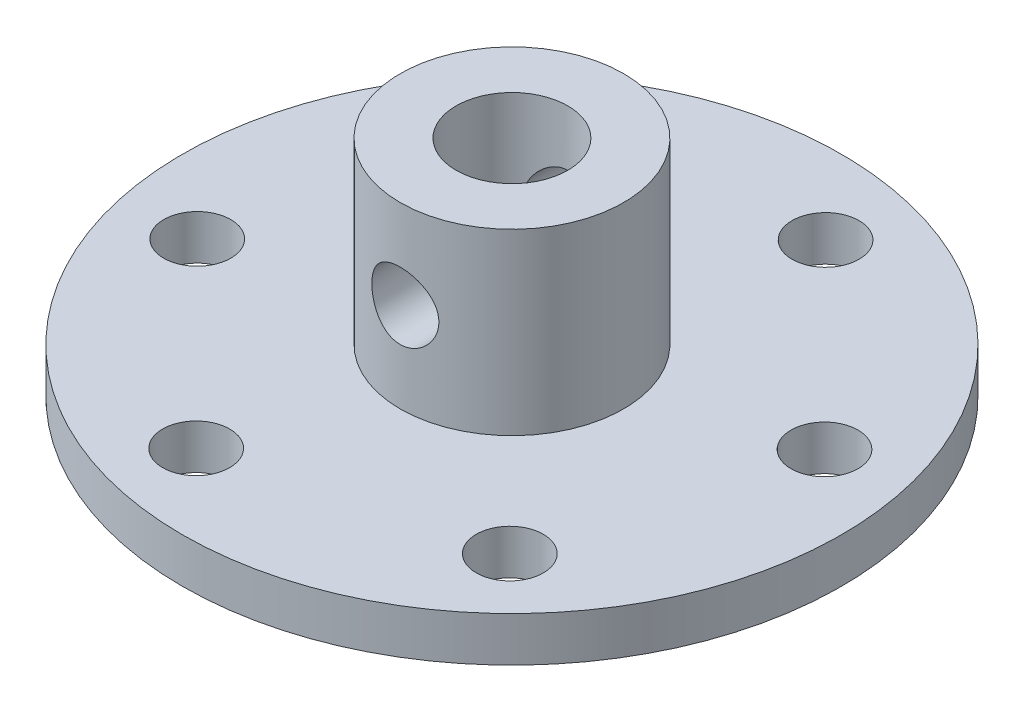
ISO-10303-21;
HEADER;
FILE_DESCRIPTION(('STEP AP214'),'2;1');
FILE_NAME('part.step','',(''),(''),'','','');
FILE_SCHEMA(('AUTOMOTIVE_DESIGN { 1 0 10303 214 1 1 1 1 }'));
ENDSEC;
DATA;
#1=APPLICATION_CONTEXT('core data for automotive mechanical design processes');
#2=APPLICATION_PROTOCOL_DEFINITION('international standard','automotive_design',2000,#1);
#3=PRODUCT_CONTEXT('',#1,'mechanical');
#4=PRODUCT('Part','Part','',(#3));
#5=PRODUCT_RELATED_PRODUCT_CATEGORY('part','',(#4));
#6=PRODUCT_DEFINITION_FORMATION('','',#4);
#7=PRODUCT_DEFINITION_CONTEXT('part definition',#1,'design');
#8=PRODUCT_DEFINITION('design','',#6,#7);
#9=PRODUCT_DEFINITION_SHAPE('','',#8);
#10=(LENGTH_UNIT() NAMED_UNIT(*) SI_UNIT(.MILLI.,.METRE.));
#11=(NAMED_UNIT(*) PLANE_ANGLE_UNIT() SI_UNIT($,.RADIAN.));
#12=(NAMED_UNIT(*) SI_UNIT($,.STERADIAN.) SOLID_ANGLE_UNIT());
#13=UNCERTAINTY_MEASURE_WITH_UNIT(LENGTH_MEASURE(1.E-05),#10,'distance_accuracy_value','');
#14=(GEOMETRIC_REPRESENTATION_CONTEXT(3) GLOBAL_UNCERTAINTY_ASSIGNED_CONTEXT((#13)) GLOBAL_UNIT_ASSIGNED_CONTEXT((#10,
#11,#12)) REPRESENTATION_CONTEXT('',''));
#15=CARTESIAN_POINT('',(0.,0.,0.));
#16=DIRECTION('',(0.,0.,1.));
#17=DIRECTION('',(1.,0.,0.));
#18=AXIS2_PLACEMENT_3D('',#15,#16,#17);
#19=CARTESIAN_POINT('',(0.,4.,0.));
#20=DIRECTION('',(0.,1.,0.));
#21=DIRECTION('',(0.,0.,1.));
#22=AXIS2_PLACEMENT_3D('',#19,#20,#21);
#23=PLANE('',#22);
#24=CARTESIAN_POINT('',(0.,4.,0.));
#25=DIRECTION('',(0.,1.,0.));
#26=DIRECTION('',(0.,0.,1.));
#27=AXIS2_PLACEMENT_3D('',#24,#25,#26);
#28=CIRCLE('',#27,10.);
#29=CARTESIAN_POINT('',(0.,4.,10.));
#30=VERTEX_POINT('',#29);
#31=EDGE_CURVE('E178',#30,#30,#28,.T.);
#32=ORIENTED_EDGE('',*,*,#31,.F.);
#33=EDGE_LOOP('',(#32));
#34=FACE_BOUND('',#33,.T.);
#35=CARTESIAN_POINT('',(-6.08221572617099,4.,22.1816273574126));
#36=DIRECTION('',(0.,1.,0.));
#37=DIRECTION('',(0.,0.,1.));
#38=AXIS2_PLACEMENT_3D('',#35,#36,#37);
#39=CIRCLE('',#38,3.);
#40=CARTESIAN_POINT('',(-6.08221572617099,4.,25.1816273574126));
#41=VERTEX_POINT('',#40);
#42=EDGE_CURVE('E182',#41,#41,#39,.T.);
#43=ORIENTED_EDGE('',*,*,#42,.F.);
#44=EDGE_LOOP('',(#43));
#45=FACE_BOUND('',#44,.T.);
#46=CARTESIAN_POINT('',(22.1215829630717,4.,-5.85812699578095));
#47=DIRECTION('',(0.,1.,0.));
#48=DIRECTION('',(0.,0.,1.));
#49=AXIS2_PLACEMENT_3D('',#46,#47,#48);
#50=CIRCLE('',#49,3.);
#51=CARTESIAN_POINT('',(22.1215829630717,4.,-2.85812699578095));
#52=VERTEX_POINT('',#51);
#53=EDGE_CURVE('E193',#52,#52,#50,.T.);
#54=ORIENTED_EDGE('',*,*,#53,.F.);
#55=EDGE_LOOP('',(#54));
#56=FACE_BOUND('',#55,.T.);
#57=CARTESIAN_POINT('',(-16.2634559672906,4.,-16.2634559672906));
#58=DIRECTION('',(0.,1.,0.));
#59=DIRECTION('',(0.,0.,1.));
#60=AXIS2_PLACEMENT_3D('',#57,#58,#59);
#61=CIRCLE('',#60,3.);
#62=CARTESIAN_POINT('',(-16.2634559672906,4.,-13.2634559672906));
#63=VERTEX_POINT('',#62);
#64=EDGE_CURVE('E204',#63,#63,#61,.T.);
#65=ORIENTED_EDGE('',*,*,#64,.F.);
#66=EDGE_LOOP('',(#65));
#67=FACE_BOUND('',#66,.T.);
#68=CARTESIAN_POINT('',(0.,4.,0.));
#69=DIRECTION('',(0.,1.,0.));
#70=DIRECTION('',(0.,0.,1.));
#71=AXIS2_PLACEMENT_3D('',#68,#69,#70);
#72=CIRCLE('',#71,29.5);
#73=CARTESIAN_POINT('',(0.,4.,29.5));
#74=VERTEX_POINT('',#73);
#75=EDGE_CURVE('E55',#74,#74,#72,.T.);
#76=ORIENTED_EDGE('',*,*,#75,.T.);
#77=EDGE_LOOP('',(#76));
#78=FACE_BOUND('',#77,.T.);
#79=CARTESIAN_POINT('',(5.93282323924444,4.,-22.1415977611853));
#80=DIRECTION('',(0.,1.,0.));
#81=DIRECTION('',(0.,0.,1.));
#82=AXIS2_PLACEMENT_3D('',#79,#80,#81);
#83=CIRCLE('',#82,3.);
#84=CARTESIAN_POINT('',(5.93282323924444,4.,-19.1415977611853));
#85=VERTEX_POINT('',#84);
#86=EDGE_CURVE('E198',#85,#85,#83,.T.);
#87=ORIENTED_EDGE('',*,*,#86,.F.);
#88=EDGE_LOOP('',(#87));
#89=FACE_BOUND('',#88,.T.);
#90=CARTESIAN_POINT('',(16.114063480364,4.,16.303485563518));
#91=DIRECTION('',(0.,1.,0.));
#92=DIRECTION('',(0.,0.,1.));
#93=AXIS2_PLACEMENT_3D('',#90,#91,#92);
#94=CIRCLE('',#93,3.);
#95=CARTESIAN_POINT('',(16.114063480364,4.,19.303485563518));
#96=VERTEX_POINT('',#95);
#97=EDGE_CURVE('E187',#96,#96,#94,.T.);
#98=ORIENTED_EDGE('',*,*,#97,.F.);
#99=EDGE_LOOP('',(#98));
#100=FACE_BOUND('',#99,.T.);
#101=CARTESIAN_POINT('',(-22.2709754499983,4.,5.89815659200832));
#102=DIRECTION('',(0.,1.,0.));
#103=DIRECTION('',(0.,0.,1.));
#104=AXIS2_PLACEMENT_3D('',#101,#102,#103);
#105=CIRCLE('',#104,3.);
#106=CARTESIAN_POINT('',(-22.2709754499983,4.,8.89815659200832));
#107=VERTEX_POINT('',#106);
#108=EDGE_CURVE('E168',#107,#107,#105,.T.);
#109=ORIENTED_EDGE('',*,*,#108,.F.);
#110=EDGE_LOOP('',(#109));
#111=FACE_BOUND('',#110,.T.);
#112=ADVANCED_FACE('F41',(#34,#45,#56,#67,#78,#89,#100,#111),#23,.T.);
#113=CARTESIAN_POINT('',(0.,0.,0.));
#114=DIRECTION('',(0.,1.,0.));
#115=DIRECTION('',(0.,0.,1.));
#116=AXIS2_PLACEMENT_3D('',#113,#114,#115);
#117=PLANE('',#116);
#118=CARTESIAN_POINT('',(0.,0.,0.));
#119=DIRECTION('',(0.,1.,0.));
#120=DIRECTION('',(0.,0.,1.));
#121=AXIS2_PLACEMENT_3D('',#118,#119,#120);
#122=CIRCLE('',#121,29.5);
#123=CARTESIAN_POINT('',(0.,0.,29.5));
#124=VERTEX_POINT('',#123);
#125=EDGE_CURVE('E63',#124,#124,#122,.T.);
#126=ORIENTED_EDGE('',*,*,#125,.F.);
#127=EDGE_LOOP('',(#126));
#128=FACE_BOUND('',#127,.T.);
#129=CARTESIAN_POINT('',(-16.2634559672906,0.,-16.2634559672906));
#130=DIRECTION('',(0.,1.,0.));
#131=DIRECTION('',(0.,0.,1.));
#132=AXIS2_PLACEMENT_3D('',#129,#130,#131);
#133=CIRCLE('',#132,3.);
#134=CARTESIAN_POINT('',(-16.2634559672906,0.,-13.2634559672906));
#135=VERTEX_POINT('',#134);
#136=EDGE_CURVE('E146',#135,#135,#133,.T.);
#137=ORIENTED_EDGE('',*,*,#136,.T.);
#138=EDGE_LOOP('',(#137));
#139=FACE_BOUND('',#138,.T.);
#140=CARTESIAN_POINT('',(5.93282323924444,0.,-22.1415977611853));
#141=DIRECTION('',(0.,1.,0.));
#142=DIRECTION('',(0.,0.,1.));
#143=AXIS2_PLACEMENT_3D('',#140,#141,#142);
#144=CIRCLE('',#143,3.);
#145=CARTESIAN_POINT('',(5.93282323924444,0.,-19.1415977611853));
#146=VERTEX_POINT('',#145);
#147=EDGE_CURVE('E150',#146,#146,#144,.T.);
#148=ORIENTED_EDGE('',*,*,#147,.T.);
#149=EDGE_LOOP('',(#148));
#150=FACE_BOUND('',#149,.T.);
#151=CARTESIAN_POINT('',(22.1215829630717,0.,-5.85812699578095));
#152=DIRECTION('',(0.,1.,0.));
#153=DIRECTION('',(0.,0.,1.));
#154=AXIS2_PLACEMENT_3D('',#151,#152,#153);
#155=CIRCLE('',#154,3.);
#156=CARTESIAN_POINT('',(22.1215829630717,0.,-2.85812699578095));
#157=VERTEX_POINT('',#156);
#158=EDGE_CURVE('E154',#157,#157,#155,.T.);
#159=ORIENTED_EDGE('',*,*,#158,.T.);
#160=EDGE_LOOP('',(#159));
#161=FACE_BOUND('',#160,.T.);
#162=CARTESIAN_POINT('',(16.114063480364,0.,16.303485563518));
#163=DIRECTION('',(0.,1.,0.));
#164=DIRECTION('',(0.,0.,1.));
#165=AXIS2_PLACEMENT_3D('',#162,#163,#164);
#166=CIRCLE('',#165,3.);
#167=CARTESIAN_POINT('',(16.114063480364,0.,19.303485563518));
#168=VERTEX_POINT('',#167);
#169=EDGE_CURVE('E158',#168,#168,#166,.T.);
#170=ORIENTED_EDGE('',*,*,#169,.T.);
#171=EDGE_LOOP('',(#170));
#172=FACE_BOUND('',#171,.T.);
#173=CARTESIAN_POINT('',(-6.08221572617099,0.,22.1816273574126));
#174=DIRECTION('',(0.,1.,0.));
#175=DIRECTION('',(0.,0.,1.));
#176=AXIS2_PLACEMENT_3D('',#173,#174,#175);
#177=CIRCLE('',#176,3.);
#178=CARTESIAN_POINT('',(-6.08221572617099,0.,25.1816273574126));
#179=VERTEX_POINT('',#178);
#180=EDGE_CURVE('E162',#179,#179,#177,.T.);
#181=ORIENTED_EDGE('',*,*,#180,.T.);
#182=EDGE_LOOP('',(#181));
#183=FACE_BOUND('',#182,.T.);
#184=CARTESIAN_POINT('',(-22.2709754499983,0.,5.89815659200832));
#185=DIRECTION('',(0.,1.,0.));
#186=DIRECTION('',(0.,0.,1.));
#187=AXIS2_PLACEMENT_3D('',#184,#185,#186);
#188=CIRCLE('',#187,3.);
#189=CARTESIAN_POINT('',(-22.2709754499983,0.,8.89815659200832));
#190=VERTEX_POINT('',#189);
#191=EDGE_CURVE('E165',#190,#190,#188,.T.);
#192=ORIENTED_EDGE('',*,*,#191,.T.);
#193=EDGE_LOOP('',(#192));
#194=FACE_BOUND('',#193,.T.);
#195=ADVANCED_FACE('F129',(#128,#139,#150,#161,#172,#183,#194),#117,.F.);
#196=CARTESIAN_POINT('',(0.,4.,0.));
#197=DIRECTION('',(0.,-1.,0.));
#198=DIRECTION('',(0.,0.,-1.));
#199=AXIS2_PLACEMENT_3D('',#196,#197,#198);
#200=CYLINDRICAL_SURFACE('',#199,29.5);
#201=ORIENTED_EDGE('',*,*,#75,.F.);
#202=EDGE_LOOP('',(#201));
#203=FACE_BOUND('',#202,.T.);
#204=ORIENTED_EDGE('',*,*,#125,.T.);
#205=EDGE_LOOP('',(#204));
#206=FACE_BOUND('',#205,.T.);
#207=ADVANCED_FACE('F43',(#203,#206),#200,.T.);
#208=CARTESIAN_POINT('',(-16.2634559672906,4.,-16.2634559672906));
#209=DIRECTION('',(0.,-1.,0.));
#210=DIRECTION('',(0.,0.,-1.));
#211=AXIS2_PLACEMENT_3D('',#208,#209,#210);
#212=CYLINDRICAL_SURFACE('',#211,3.);
#213=ORIENTED_EDGE('',*,*,#64,.T.);
#214=EDGE_LOOP('',(#213));
#215=FACE_BOUND('',#214,.T.);
#216=ORIENTED_EDGE('',*,*,#136,.F.);
#217=EDGE_LOOP('',(#216));
#218=FACE_BOUND('',#217,.T.);
#219=ADVANCED_FACE('F123',(#215,#218),#212,.F.);
#220=CARTESIAN_POINT('',(5.93282323924444,4.,-22.1415977611853));
#221=DIRECTION('',(0.,-1.,0.));
#222=DIRECTION('',(0.,0.,-1.));
#223=AXIS2_PLACEMENT_3D('',#220,#221,#222);
#224=CYLINDRICAL_SURFACE('',#223,3.);
#225=ORIENTED_EDGE('',*,*,#86,.T.);
#226=EDGE_LOOP('',(#225));
#227=FACE_BOUND('',#226,.T.);
#228=ORIENTED_EDGE('',*,*,#147,.F.);
#229=EDGE_LOOP('',(#228));
#230=FACE_BOUND('',#229,.T.);
#231=ADVANCED_FACE('F119',(#227,#230),#224,.F.);
#232=CARTESIAN_POINT('',(22.1215829630717,4.,-5.85812699578095));
#233=DIRECTION('',(0.,-1.,0.));
#234=DIRECTION('',(0.,0.,-1.));
#235=AXIS2_PLACEMENT_3D('',#232,#233,#234);
#236=CYLINDRICAL_SURFACE('',#235,3.);
#237=ORIENTED_EDGE('',*,*,#53,.T.);
#238=EDGE_LOOP('',(#237));
#239=FACE_BOUND('',#238,.T.);
#240=ORIENTED_EDGE('',*,*,#158,.F.);
#241=EDGE_LOOP('',(#240));
#242=FACE_BOUND('',#241,.T.);
#243=ADVANCED_FACE('F115',(#239,#242),#236,.F.);
#244=CARTESIAN_POINT('',(16.114063480364,4.,16.303485563518));
#245=DIRECTION('',(0.,-1.,0.));
#246=DIRECTION('',(0.,0.,-1.));
#247=AXIS2_PLACEMENT_3D('',#244,#245,#246);
#248=CYLINDRICAL_SURFACE('',#247,3.);
#249=ORIENTED_EDGE('',*,*,#97,.T.);
#250=EDGE_LOOP('',(#249));
#251=FACE_BOUND('',#250,.T.);
#252=ORIENTED_EDGE('',*,*,#169,.F.);
#253=EDGE_LOOP('',(#252));
#254=FACE_BOUND('',#253,.T.);
#255=ADVANCED_FACE('F111',(#251,#254),#248,.F.);
#256=CARTESIAN_POINT('',(-6.08221572617099,4.,22.1816273574126));
#257=DIRECTION('',(0.,-1.,0.));
#258=DIRECTION('',(0.,0.,-1.));
#259=AXIS2_PLACEMENT_3D('',#256,#257,#258);
#260=CYLINDRICAL_SURFACE('',#259,3.);
#261=ORIENTED_EDGE('',*,*,#42,.T.);
#262=EDGE_LOOP('',(#261));
#263=FACE_BOUND('',#262,.T.);
#264=ORIENTED_EDGE('',*,*,#180,.F.);
#265=EDGE_LOOP('',(#264));
#266=FACE_BOUND('',#265,.T.);
#267=ADVANCED_FACE('F107',(#263,#266),#260,.F.);
#268=CARTESIAN_POINT('',(-22.2709754499983,4.,5.89815659200832));
#269=DIRECTION('',(0.,-1.,0.));
#270=DIRECTION('',(0.,0.,-1.));
#271=AXIS2_PLACEMENT_3D('',#268,#269,#270);
#272=CYLINDRICAL_SURFACE('',#271,3.);
#273=ORIENTED_EDGE('',*,*,#108,.T.);
#274=EDGE_LOOP('',(#273));
#275=FACE_BOUND('',#274,.T.);
#276=ORIENTED_EDGE('',*,*,#191,.F.);
#277=EDGE_LOOP('',(#276));
#278=FACE_BOUND('',#277,.T.);
#279=ADVANCED_FACE('F103',(#275,#278),#272,.F.);
#280=CARTESIAN_POINT('',(0.,20.,0.));
#281=DIRECTION('',(0.,1.,0.));
#282=DIRECTION('',(0.,0.,1.));
#283=AXIS2_PLACEMENT_3D('',#280,#281,#282);
#284=PLANE('',#283);
#285=CARTESIAN_POINT('',(0.,20.,0.));
#286=DIRECTION('',(0.,1.,0.));
#287=DIRECTION('',(0.,0.,1.));
#288=AXIS2_PLACEMENT_3D('',#285,#286,#287);
#289=CIRCLE('',#288,10.);
#290=CARTESIAN_POINT('',(0.,20.,10.));
#291=VERTEX_POINT('',#290);
#292=EDGE_CURVE('E169',#291,#291,#289,.T.);
#293=ORIENTED_EDGE('',*,*,#292,.T.);
#294=EDGE_LOOP('',(#293));
#295=FACE_BOUND('',#294,.T.);
#296=CARTESIAN_POINT('',(0.,20.,0.));
#297=DIRECTION('',(0.,1.,0.));
#298=DIRECTION('',(0.,0.,1.));
#299=AXIS2_PLACEMENT_3D('',#296,#297,#298);
#300=CIRCLE('',#299,5.);
#301=CARTESIAN_POINT('',(0.,20.,5.));
#302=VERTEX_POINT('',#301);
#303=EDGE_CURVE('E215',#302,#302,#300,.T.);
#304=ORIENTED_EDGE('',*,*,#303,.F.);
#305=EDGE_LOOP('',(#304));
#306=FACE_BOUND('',#305,.T.);
#307=ADVANCED_FACE('F101',(#295,#306),#284,.T.);
#308=CARTESIAN_POINT('',(0.,20.,0.));
#309=DIRECTION('',(0.,-1.,0.));
#310=DIRECTION('',(0.,0.,-1.));
#311=AXIS2_PLACEMENT_3D('',#308,#309,#310);
#312=CYLINDRICAL_SURFACE('',#311,10.);
#313=CARTESIAN_POINT('',(0.,15.,-10.));
#314=CARTESIAN_POINT('',(-0.1645772255066,14.9999980050302,-9.99999858501101));
#315=CARTESIAN_POINT('',(-0.329174636703059,14.9864122727521,-9.99589831387907));
#316=CARTESIAN_POINT('',(-0.653576250609762,14.9325572915558,-9.97994211187382));
#317=CARTESIAN_POINT('',(-0.81337900882284,14.8922800839533,-9.96808386779384));
#318=CARTESIAN_POINT('',(-1.12346541550905,14.7865079661795,-9.93791105003673));
#319=CARTESIAN_POINT('',(-1.27376272879075,14.7210502607621,-9.91960600500851));
#320=CARTESIAN_POINT('',(-1.56124836210626,14.5669278138883,-9.87844218475291));
#321=CARTESIAN_POINT('',(-1.69843493493934,14.4782599852092,-9.85558280384133));
#322=CARTESIAN_POINT('',(-1.95974359436749,14.2775519850547,-9.80701474385548));
#323=CARTESIAN_POINT('',(-2.08343614248868,14.1649667482282,-9.78124767314073));
#324=CARTESIAN_POINT('',(-2.31049841846647,13.9207815401796,-9.73011668420884));
#325=CARTESIAN_POINT('',(-2.41386472654882,13.7891783757501,-9.70475283449003));
#326=CARTESIAN_POINT('',(-2.59960075447415,13.5070584939248,-9.65668227987544));
#327=CARTESIAN_POINT('',(-2.68144618044427,13.3561830780185,-9.63404813327749));
#328=CARTESIAN_POINT('',(-2.81842789549521,13.0420214915394,-9.59487240788062));
#329=CARTESIAN_POINT('',(-2.87357059839947,12.878738312144,-9.57832936626621));
#330=CARTESIAN_POINT('',(-2.95403267365303,12.5492194677391,-9.55381741676868));
#331=CARTESIAN_POINT('',(-2.98014392469355,12.3831945122721,-9.54562138649067));
#332=CARTESIAN_POINT('',(-3.00427461229344,12.0489336875665,-9.53805579499534));
#333=CARTESIAN_POINT('',(-3.00230085522157,11.8806983638818,-9.53868409521142));
#334=CARTESIAN_POINT('',(-2.97093954399623,11.553232182783,-9.54849488135555));
#335=CARTESIAN_POINT('',(-2.9425441052537,11.3938954992755,-9.55736777198281));
#336=CARTESIAN_POINT('',(-2.86074840854112,11.0823604274531,-9.58216712457248));
#337=CARTESIAN_POINT('',(-2.80734568283282,10.9301627452513,-9.59809428264701));
#338=CARTESIAN_POINT('',(-2.67632053307363,10.6347993006785,-9.63545466149946));
#339=CARTESIAN_POINT('',(-2.59837633869285,10.4917858320895,-9.65696032231904));
#340=CARTESIAN_POINT('',(-2.42070445177367,10.2205359559796,-9.70301974000129));
#341=CARTESIAN_POINT('',(-2.32097148005177,10.0923031411724,-9.72757423493982));
#342=CARTESIAN_POINT('',(-2.09762581531093,9.84862761847596,-9.77822022595875));
#343=CARTESIAN_POINT('',(-1.97318981493394,9.73394267194066,-9.80433308620996));
#344=CARTESIAN_POINT('',(-1.70652651862793,9.5268920318715,-9.85424488126517));
#345=CARTESIAN_POINT('',(-1.56429810372178,9.43452774317115,-9.8780436703682));
#346=CARTESIAN_POINT('',(-1.26471007668561,9.27428015507054,-9.92086320138941));
#347=CARTESIAN_POINT('',(-1.1072554994959,9.20656496750028,-9.93985087336628));
#348=CARTESIAN_POINT('',(-0.782490831207039,9.09880081980074,-9.97067043664444));
#349=CARTESIAN_POINT('',(-0.615183503179163,9.05874414293502,-9.98250432373999));
#350=CARTESIAN_POINT('',(-0.281904485336664,9.00869564420121,-9.99736729287077));
#351=CARTESIAN_POINT('',(-0.116100195202375,8.99767682839678,-10.0006970083558));
#352=CARTESIAN_POINT('',(0.214999211646765,9.00313831142416,-9.99905846483519));
#353=CARTESIAN_POINT('',(0.380294393381561,9.01961493930289,-9.99409131355514));
#354=CARTESIAN_POINT('',(0.701807210619393,9.07876922222299,-9.97661393974325));
#355=CARTESIAN_POINT('',(0.858145545228339,9.12084677516174,-9.96427659598829));
#356=CARTESIAN_POINT('',(1.16150927790904,9.2292864655564,-9.9334869568307));
#357=CARTESIAN_POINT('',(1.30853355405117,9.29565152207572,-9.91503392642188));
#358=CARTESIAN_POINT('',(1.5928743789221,9.45250633096227,-9.87339308702631));
#359=CARTESIAN_POINT('',(1.72988765239933,9.54351868189596,-9.8501056165928));
#360=CARTESIAN_POINT('',(1.9870466159603,9.74644950810561,-9.80146937528705));
#361=CARTESIAN_POINT('',(2.10718806471188,9.8583732237753,-9.7761200886242));
#362=CARTESIAN_POINT('',(2.33171489102052,10.1047746167387,-9.72506343738007));
#363=CARTESIAN_POINT('',(2.43536962463001,10.2399237515437,-9.69937650065513));
#364=CARTESIAN_POINT('',(2.61857990144313,10.5262558780269,-9.65153030477949));
#365=CARTESIAN_POINT('',(2.69813607658965,10.6774384491158,-9.62937095313121));
#366=CARTESIAN_POINT('',(2.83034694254316,10.99106498251,-9.5913437922631));
#367=CARTESIAN_POINT('',(2.88312693874022,11.1534523730757,-9.57544675673501));
#368=CARTESIAN_POINT('',(2.96043461630306,11.4853759378605,-9.55183188739737));
#369=CARTESIAN_POINT('',(2.98497197957849,11.6549096415661,-9.54411125069387));
#370=CARTESIAN_POINT('',(3.0044396896993,11.9887230367768,-9.53799944941558));
#371=CARTESIAN_POINT('',(3.00056110615887,12.1529273020988,-9.53923294700394));
#372=CARTESIAN_POINT('',(2.9661501088861,12.4782282068012,-9.54998802392188));
#373=CARTESIAN_POINT('',(2.93561876249408,12.639324970361,-9.55950927135902));
#374=CARTESIAN_POINT('',(2.84953777608686,12.9518907982633,-9.58551527389243));
#375=CARTESIAN_POINT('',(2.79430351014248,13.1034545747174,-9.60191209104934));
#376=CARTESIAN_POINT('',(2.66063014242147,13.3952848776414,-9.63980557805265));
#377=CARTESIAN_POINT('',(2.58218659925722,13.5355492352831,-9.6613032238508));
#378=CARTESIAN_POINT('',(2.40097527610175,13.8063262330525,-9.70795352855338));
#379=CARTESIAN_POINT('',(2.29742552185996,13.9362975225204,-9.7332108032858));
#380=CARTESIAN_POINT('',(2.07034869259555,14.1774049966162,-9.78402640899066));
#381=CARTESIAN_POINT('',(1.94681643426898,14.2885362789356,-9.80958481647543));
#382=CARTESIAN_POINT('',(1.67893152436652,14.4920468245899,-9.85901873141573));
#383=CARTESIAN_POINT('',(1.53407577158122,14.5837828937109,-9.88282319531421));
#384=CARTESIAN_POINT('',(1.23028274796705,14.7414703398081,-9.92521360911553));
#385=CARTESIAN_POINT('',(1.07135210599791,14.807433776549,-9.94380199862114));
#386=CARTESIAN_POINT('',(0.761515425310564,14.9057905513055,-9.97204349938619));
#387=CARTESIAN_POINT('',(0.611573923908469,14.9410233457665,-9.9824405476214));
#388=CARTESIAN_POINT('',(0.307760390461558,14.9881270504832,-9.9964188898898));
#389=CARTESIAN_POINT('',(0.153889019716279,15.0000018654096,-10.0000013230948));
#390=CARTESIAN_POINT('',(0.,15.,-10.));
#391=B_SPLINE_CURVE_WITH_KNOTS('',3,(#313,#314,#315,#316,#317,#318,#319,#320,#321,#322,#323,
#324,#325,#326,#327,#328,#329,#330,#331,#332,#333,#334,#335,#336,#337,#338,#339,#340,#341,#342,
#343,#344,#345,#346,#347,#348,#349,#350,#351,#352,#353,#354,#355,#356,#357,#358,#359,#360,#361,
#362,#363,#364,#365,#366,#367,#368,#369,#370,#371,#372,#373,#374,#375,#376,#377,#378,#379,#380,
#381,#382,#383,#384,#385,#386,#387,#388,#389,#390),.UNSPECIFIED.,.T.,.F.,(4,2,2,2,2,2,2,2,2,2,2,
2,2,2,2,2,2,2,2,2,2,2,2,2,2,2,2,2,2,2,2,2,2,2,2,2,2,2,4),(0.,0.493166407225221,
0.986479929691999,1.47906735260175,1.9717203288254,2.47711205896383,2.98258874577266,
3.49942962008218,4.01614629086447,4.51839378713198,5.02051956638179,5.50452033395352,
5.98856887316003,6.47924852894239,6.97004720317111,7.48134208096333,7.99266913062143,
8.50742093763377,9.02202907057615,9.5181761887709,10.0142570710065,10.4991349336465,
10.9840710918746,11.4802261140582,11.9765056400038,12.4908080064564,13.0050968850536,
13.516956299025,14.0286401892057,14.5190031093854,15.0093463933232,15.4936008081456,
15.9779479511534,16.4799385136898,16.9820594980413,17.4988599232246,18.0154182319959,
18.4766338387004,18.9377723390687),.UNSPECIFIED.);
#392=CARTESIAN_POINT('',(0.,15.,-10.));
#393=VERTEX_POINT('',#392);
#394=EDGE_CURVE('E92',#393,#393,#391,.T.);
#395=ORIENTED_EDGE('',*,*,#394,.T.);
#396=EDGE_LOOP('',(#395));
#397=FACE_BOUND('',#396,.T.);
#398=CARTESIAN_POINT('',(3.,12.,9.53939201416946));
#399=CARTESIAN_POINT('',(2.99999795267528,11.8356109041152,9.5393937145396));
#400=CARTESIAN_POINT('',(2.98644216334284,11.671201551712,9.54368780418137));
#401=CARTESIAN_POINT('',(2.93271688893498,11.3471895008161,9.56033156605799));
#402=CARTESIAN_POINT('',(2.89253851147156,11.1875884269971,9.57268392986936));
#403=CARTESIAN_POINT('',(2.78705506539911,10.8779305434565,9.60392204971265));
#404=CARTESIAN_POINT('',(2.72179178788487,10.7278583407338,9.62279693406465));
#405=CARTESIAN_POINT('',(2.56812843835858,10.4407561320094,9.66493865095134));
#406=CARTESIAN_POINT('',(2.47972490274105,10.3037280826311,9.68820614082039));
#407=CARTESIAN_POINT('',(2.27929508283254,10.0422672188452,9.73733724371531));
#408=CARTESIAN_POINT('',(2.16666414351613,9.91830820410742,9.76325616623271));
#409=CARTESIAN_POINT('',(1.9222724751592,9.69072409735498,9.81429723873514));
#410=CARTESIAN_POINT('',(1.79050929092222,9.58710161910024,9.8394192859541));
#411=CARTESIAN_POINT('',(1.50822287558738,9.40107460033338,9.88666429158777));
#412=CARTESIAN_POINT('',(1.35736804267163,9.31915315111438,9.90871448684808));
#413=CARTESIAN_POINT('',(1.0432492907387,9.18202548191449,9.94668871841369));
#414=CARTESIAN_POINT('',(0.879988056775818,9.1268135002851,9.96261407578992));
#415=CARTESIAN_POINT('',(0.550647705261656,9.04623999781898,9.98615292007178));
#416=CARTESIAN_POINT('',(0.3847827979076,9.02006974469459,9.99399114738673));
#417=CARTESIAN_POINT('',(0.0508436474986245,8.99576535070712,10.001264030027));
#418=CARTESIAN_POINT('',(-0.117230124100747,8.99762532119609,10.0007004504217));
#419=CARTESIAN_POINT('',(-0.445142313200318,9.02878573708604,9.99139207635305));
#420=CARTESIAN_POINT('',(-0.605072535282663,9.0572103876197,9.98290840410475));
#421=CARTESIAN_POINT('',(-0.917778426885079,9.13926267198862,9.95903044225231));
#422=CARTESIAN_POINT('',(-1.07055364264578,9.1928919018855,9.9436357150134));
#423=CARTESIAN_POINT('',(-1.36669465270248,9.32442404683696,9.90730441973756));
#424=CARTESIAN_POINT('',(-1.50993012938864,9.40260240561395,9.88630539352772));
#425=CARTESIAN_POINT('',(-1.78152934756663,9.58079570485705,9.84099281296778));
#426=CARTESIAN_POINT('',(-1.90988954974545,9.68081582592918,9.81667847277943));
#427=CARTESIAN_POINT('',(-2.15332096305837,9.90439550150091,9.76623100973852));
#428=CARTESIAN_POINT('',(-2.26768916079756,10.0287138380508,9.74006390633503));
#429=CARTESIAN_POINT('',(-2.47415303080115,10.2950200357888,9.68967959784414));
#430=CARTESIAN_POINT('',(-2.56624648967452,10.437009650811,9.66546258669242));
#431=CARTESIAN_POINT('',(-2.72627990669511,10.7364789384722,9.62155806359712));
#432=CARTESIAN_POINT('',(-2.79397978469378,10.8940940916175,9.6019162125849));
#433=CARTESIAN_POINT('',(-2.90166725750739,11.2192144167786,9.5699278496379));
#434=CARTESIAN_POINT('',(-2.94166389279494,11.3867163430351,9.55757895796639));
#435=CARTESIAN_POINT('',(-2.99149540565762,11.7201647215024,9.54209699116239));
#436=CARTESIAN_POINT('',(-3.00239892760807,11.8859364477944,9.53863757349917));
#437=CARTESIAN_POINT('',(-2.99671894465741,12.2169458000133,9.54042384874812));
#438=CARTESIAN_POINT('',(-2.98013928742559,12.38218349746,9.54566832310787));
#439=CARTESIAN_POINT('',(-2.92091527148479,12.7029767559434,9.56395117112153));
#440=CARTESIAN_POINT('',(-2.87895922862587,12.8586723285275,9.57678353015602));
#441=CARTESIAN_POINT('',(-2.77097155495853,13.1608033816294,9.6085828246183));
#442=CARTESIAN_POINT('',(-2.70493620685512,13.307237428281,9.62755070717977));
#443=CARTESIAN_POINT('',(-2.54863742393008,13.5910349281444,9.67011670046268));
#444=CARTESIAN_POINT('',(-2.4577712834546,13.7280494419716,9.69382542139644));
#445=CARTESIAN_POINT('',(-2.25510603200767,13.9852762123616,9.74296411293928));
#446=CARTESIAN_POINT('',(-2.14330191069793,14.1054844352256,9.76839449459994));
#447=CARTESIAN_POINT('',(-1.8969102649872,14.3303608116295,9.81927267096329));
#448=CARTESIAN_POINT('',(-1.76162213171487,14.434271257974,9.84468490126011));
#449=CARTESIAN_POINT('',(-1.47492356918049,14.6179334020555,9.89169703497298));
#450=CARTESIAN_POINT('',(-1.32351394108789,14.6976862995629,9.91329712769433));
#451=CARTESIAN_POINT('',(-1.00987100941044,14.8300000611366,9.95011940949915));
#452=CARTESIAN_POINT('',(-0.847729244075675,14.882764032318,9.96538906849932));
#453=CARTESIAN_POINT('',(-0.516339933009174,14.9601218377808,9.98803959193653));
#454=CARTESIAN_POINT('',(-0.347094434709524,14.9847237318968,9.9954227134176));
#455=CARTESIAN_POINT('',(-0.0133043077654845,15.004446088109,10.001330881628));
#456=CARTESIAN_POINT('',(0.151170358172414,15.0006653908157,10.0001861022264));
#457=CARTESIAN_POINT('',(0.477038962328809,14.9663567350018,9.98994528930073));
#458=CARTESIAN_POINT('',(0.638433074693058,14.9358302930391,9.98084970660925));
#459=CARTESIAN_POINT('',(0.951871626082718,14.8495766772007,9.95582336716653));
#460=CARTESIAN_POINT('',(1.10399785470279,14.794123638702,9.93996705801731));
#461=CARTESIAN_POINT('',(1.39686647550411,14.6598361709856,9.903058860789));
#462=CARTESIAN_POINT('',(1.53760699210116,14.5809978994276,9.88200611899892));
#463=CARTESIAN_POINT('',(1.80860378484113,14.3992530851399,9.83607931656457));
#464=CARTESIAN_POINT('',(1.93838050015354,14.2956571399985,9.81110453847119));
#465=CARTESIAN_POINT('',(2.17907514269189,14.0685792233344,9.76047074424668));
#466=CARTESIAN_POINT('',(2.28998761920387,13.9450915242037,9.73481153282158));
#467=CARTESIAN_POINT('',(2.49312538789097,13.677318443379,9.68481361262638));
#468=CARTESIAN_POINT('',(2.58469519515913,13.5325228932191,9.66053705386971));
#469=CARTESIAN_POINT('',(2.74208627057551,13.228889651678,9.61705095017586));
#470=CARTESIAN_POINT('',(2.80791991114577,13.0700587527976,9.59783897193911));
#471=CARTESIAN_POINT('',(2.90603885065899,12.7605191367875,9.56855633435189));
#472=CARTESIAN_POINT('',(2.94117718022463,12.610782706138,9.5577230968104));
#473=CARTESIAN_POINT('',(2.98815637670288,12.3073695550085,9.54314085194333));
#474=CARTESIAN_POINT('',(3.00000191412191,12.1536936307095,9.53939042442861));
#475=CARTESIAN_POINT('',(3.,12.,9.53939201416946));
#476=B_SPLINE_CURVE_WITH_KNOTS('',3,(#398,#399,#400,#401,#402,#403,#404,#405,#406,#407,#408,
#409,#410,#411,#412,#413,#414,#415,#416,#417,#418,#419,#420,#421,#422,#423,#424,#425,#426,#427,
#428,#429,#430,#431,#432,#433,#434,#435,#436,#437,#438,#439,#440,#441,#442,#443,#444,#445,#446,
#447,#448,#449,#450,#451,#452,#453,#454,#455,#456,#457,#458,#459,#460,#461,#462,#463,#464,#465,
#466,#467,#468,#469,#470,#471,#472,#473,#474,#475),.UNSPECIFIED.,.T.,.F.,(4,2,2,2,2,2,2,2,2,2,2,
2,2,2,2,2,2,2,2,2,2,2,2,2,2,2,2,2,2,2,2,2,2,2,2,2,2,2,4),(0.,0.492600331831085,
0.985365283378001,1.47731282893239,1.9693340507402,2.47546300015968,2.98165695742546,
3.4983187854729,4.01486911175754,4.51664280299116,5.01831108202881,5.50400251981761,
5.98972471780753,6.48110418671353,6.97260033181661,7.48304294046556,7.99353624983726,
8.50892476494934,9.02414501262032,9.52016161585828,10.0161087821999,10.4991718988284,
10.9823096209678,11.4784146362399,11.9746385186306,12.4895901220641,13.0045161465361,
13.5155078363386,14.0263532464857,14.5175260782765,15.0086710610072,15.4945419374965,
15.9804926898797,16.4819925411419,16.9836370526499,17.500232793435,18.016579879331,
18.477223077201,18.9377739007233),.UNSPECIFIED.);
#477=CARTESIAN_POINT('',(3.,12.,9.53939201416946));
#478=VERTEX_POINT('',#477);
#479=EDGE_CURVE('E85',#478,#478,#476,.T.);
#480=ORIENTED_EDGE('',*,*,#479,.T.);
#481=EDGE_LOOP('',(#480));
#482=FACE_BOUND('',#481,.T.);
#483=ORIENTED_EDGE('',*,*,#292,.F.);
#484=EDGE_LOOP('',(#483));
#485=FACE_BOUND('',#484,.T.);
#486=ORIENTED_EDGE('',*,*,#31,.T.);
#487=EDGE_LOOP('',(#486));
#488=FACE_BOUND('',#487,.T.);
#489=ADVANCED_FACE('F97',(#397,#482,#485,#488),#312,.T.);
#490=CARTESIAN_POINT('',(0.,20.,0.));
#491=DIRECTION('',(0.,-1.,0.));
#492=DIRECTION('',(0.,0.,-1.));
#493=AXIS2_PLACEMENT_3D('',#490,#491,#492);
#494=CYLINDRICAL_SURFACE('',#493,5.);
#495=CARTESIAN_POINT('',(0.,15.,-5.));
#496=CARTESIAN_POINT('',(-0.0767697294351705,14.9999989437555,-4.99999907546385));
#497=CARTESIAN_POINT('',(-0.153562134518387,14.9970464064299,-4.99822567812271));
#498=CARTESIAN_POINT('',(-0.306548487758715,14.9852857670203,-4.99118362570631));
#499=CARTESIAN_POINT('',(-0.382742059346592,14.9764742388118,-4.98591292553957));
#500=CARTESIAN_POINT('',(-0.609808130024627,14.9413514405369,-4.96499345352549));
#501=CARTESIAN_POINT('',(-0.758981863291667,14.9063522975666,-4.94423772571335));
#502=CARTESIAN_POINT('',(-1.04754167363585,14.8152272564959,-4.89123238995897));
#503=CARTESIAN_POINT('',(-1.18697226741342,14.7592060779873,-4.8590397955111));
#504=CARTESIAN_POINT('',(-1.45405042800218,14.628279339403,-4.7859070225578));
#505=CARTESIAN_POINT('',(-1.58170090938261,14.5533784676398,-4.74496901614699));
#506=CARTESIAN_POINT('',(-1.83260160381823,14.3804503448849,-4.65410731283371));
#507=CARTESIAN_POINT('',(-1.95476885986166,14.2810926088335,-4.60373587041895));
#508=CARTESIAN_POINT('',(-2.1817645874806,14.0650655928078,-4.50060875905921));
#509=CARTESIAN_POINT('',(-2.28657046750404,13.9483741257816,-4.4478500955754));
#510=CARTESIAN_POINT('',(-2.48890019509838,13.6841529788311,-4.33822134833335));
#511=CARTESIAN_POINT('',(-2.5839553962784,13.5345964578778,-4.28164035635797));
#512=CARTESIAN_POINT('',(-2.74722868670786,13.2183068536731,-4.17876602596121));
#513=CARTESIAN_POINT('',(-2.8154903315581,13.0516022079668,-4.13245604474886));
#514=CARTESIAN_POINT('',(-2.90881204577224,12.7468070983431,-4.06709259377223));
#515=CARTESIAN_POINT('',(-2.94032394587637,12.6115280016386,-4.04415766338645));
#516=CARTESIAN_POINT('',(-2.98432344587083,12.3363925694786,-4.01180616527621));
#517=CARTESIAN_POINT('',(-2.99683469884359,12.196542146696,-4.00237279089368));
#518=CARTESIAN_POINT('',(-3.0021101681982,11.9159770073521,-3.99841845126251));
#519=CARTESIAN_POINT('',(-2.99483563630785,11.7752611340881,-4.00392674756739));
#520=CARTESIAN_POINT('',(-2.96092124146105,11.4974424648821,-4.02906522155629));
#521=CARTESIAN_POINT('',(-2.93426681225441,11.3603424670585,-4.04870602134773));
#522=CARTESIAN_POINT('',(-2.86347831933193,11.0949394577495,-4.09906376582929));
#523=CARTESIAN_POINT('',(-2.8195745342289,10.9665456770055,-4.12963433300038));
#524=CARTESIAN_POINT('',(-2.7159016746707,10.7186102333682,-4.19854092703026));
#525=CARTESIAN_POINT('',(-2.65612678414159,10.599071836171,-4.2368797994146));
#526=CARTESIAN_POINT('',(-2.5103577382067,10.3500308623437,-4.32510698365561));
#527=CARTESIAN_POINT('',(-2.42160671901867,10.2224400076323,-4.3758426358075));
#528=CARTESIAN_POINT('',(-2.22582963207776,9.98265084277988,-4.4786102252415));
#529=CARTESIAN_POINT('',(-2.11878609335504,9.87046743459787,-4.53064336077654));
#530=CARTESIAN_POINT('',(-1.87159040921357,9.64875774055151,-4.63871766962914));
#531=CARTESIAN_POINT('',(-1.72890315178768,9.54178060876265,-4.69430681953073));
#532=CARTESIAN_POINT('',(-1.50061053630278,9.40073128727714,-4.77018325995047));
#533=CARTESIAN_POINT('',(-1.42209821815681,9.35693586448389,-4.79423315237467));
#534=CARTESIAN_POINT('',(-1.26074368673913,9.276281176389,-4.83916496756429));
#535=CARTESIAN_POINT('',(-1.17790417501175,9.23941764797919,-4.86004883588963));
#536=CARTESIAN_POINT('',(-1.01376371174,9.17518855714336,-4.8968267274493));
#537=CARTESIAN_POINT('',(-0.932690066663953,9.14737343955079,-4.91295100454953));
#538=CARTESIAN_POINT('',(-0.767879949732822,9.09866604415477,-4.94139126794745));
#539=CARTESIAN_POINT('',(-0.684144997174634,9.07776989155364,-4.95370938553284));
#540=CARTESIAN_POINT('',(-0.514744462654421,9.04322814527524,-4.97416370514887));
#541=CARTESIAN_POINT('',(-0.429080341969607,9.02957724417139,-4.98230296820872));
#542=CARTESIAN_POINT('',(-0.256621746592204,9.00973381560979,-4.99415996414414));
#543=CARTESIAN_POINT('',(-0.169827432617756,9.00354023914868,-4.99787831889699));
#544=CARTESIAN_POINT('',(0.0673242571106453,8.99700732971637,-5.00179157954795));
#545=CARTESIAN_POINT('',(0.218056842610663,9.0041884543694,-4.99746512571837));
#546=CARTESIAN_POINT('',(0.515686907628999,9.0408455417291,-4.97557955020067));
#547=CARTESIAN_POINT('',(0.662584464852968,9.07032105234186,-4.95802069684413));
#548=CARTESIAN_POINT('',(0.945142599254815,9.14908845918428,-4.91189447655688));
#549=CARTESIAN_POINT('',(1.08098954856944,9.19788112659201,-4.88360514429733));
#550=CARTESIAN_POINT('',(1.34253345184752,9.31335432420091,-4.81827798628348));
#551=CARTESIAN_POINT('',(1.46822839746276,9.38003838259407,-4.78123843515362));
#552=CARTESIAN_POINT('',(1.7200119213015,9.53711409097797,-4.69690981059277));
#553=CARTESIAN_POINT('',(1.84478813824221,9.62924769383748,-4.6489560240695));
#554=CARTESIAN_POINT('',(2.07805222548222,9.83078275125476,-4.54948534225871));
#555=CARTESIAN_POINT('',(2.18652085154156,9.94020429960271,-4.49796434043363));
#556=CARTESIAN_POINT('',(2.39863988264158,10.1898207914932,-4.38890846835682));
#557=CARTESIAN_POINT('',(2.49982037884172,10.332167773943,-4.33146483230154));
#558=CARTESIAN_POINT('',(2.67690479207535,10.6344320461276,-4.22432364395571));
#559=CARTESIAN_POINT('',(2.75283533845462,10.7943305871513,-4.1746179606141));
#560=CARTESIAN_POINT('',(2.86285157351706,11.0924860451107,-4.09969818429266));
#561=CARTESIAN_POINT('',(2.90243250662613,11.227960624642,-4.07151318633887));
#562=CARTESIAN_POINT('',(2.96227327821697,11.5050641562352,-4.02819211510624));
#563=CARTESIAN_POINT('',(2.98255990395067,11.6466842894515,-4.01303795327895));
#564=CARTESIAN_POINT('',(3.00268261034206,11.9327538943952,-3.99800893189922));
#565=CARTESIAN_POINT('',(3.00244179030845,12.0772119782483,-3.99819152744816));
#566=CARTESIAN_POINT('',(2.98132945103105,12.3637888743464,-4.01395435932838));
#567=CARTESIAN_POINT('',(2.96044671369591,12.5059063718748,-4.02954296823692));
#568=CARTESIAN_POINT('',(2.90080351212233,12.7769768239951,-4.07266369966216));
#569=CARTESIAN_POINT('',(2.86295284328648,12.9062341479244,-4.09958421715569));
#570=CARTESIAN_POINT('',(2.77126473512031,13.1566745496532,-4.16211005816609));
#571=CARTESIAN_POINT('',(2.7174212751772,13.277854565613,-4.19771865147484));
#572=CARTESIAN_POINT('',(2.58578536859698,13.52863953946,-4.28025972950371));
#573=CARTESIAN_POINT('',(2.50558518231556,13.6566815082148,-4.32809142579694));
#574=CARTESIAN_POINT('',(2.32751213746957,13.8987608453066,-4.42640286674054));
#575=CARTESIAN_POINT('',(2.22962472612067,14.0127865504796,-4.47688476749087));
#576=CARTESIAN_POINT('',(2.00020353552556,14.2426988433295,-4.5845123827036));
#577=CARTESIAN_POINT('',(1.86578571790514,14.3558498798616,-4.64140045738634));
#578=CARTESIAN_POINT('',(1.57689277813436,14.5582079860481,-4.74731429537958));
#579=CARTESIAN_POINT('',(1.42241049573676,14.6474064729197,-4.79633723789531));
#580=CARTESIAN_POINT('',(1.18102189661685,14.7591244741905,-4.85920558314903));
#581=CARTESIAN_POINT('',(1.10025014285135,14.7923359959645,-4.87817139185349));
#582=CARTESIAN_POINT('',(0.935442217988385,14.8517721381435,-4.91243413775203));
#583=CARTESIAN_POINT('',(0.851407984788099,14.8780008357009,-4.9277332153652));
#584=CARTESIAN_POINT('',(0.681001816074564,14.9230094420757,-4.95415527987996));
#585=CARTESIAN_POINT('',(0.59463750060929,14.9418110773033,-4.9652904423195));
#586=CARTESIAN_POINT('',(0.420183746020759,14.971744355323,-4.98308318645254));
#587=CARTESIAN_POINT('',(0.332095806784395,14.9828823861533,-4.98974449723791));
#588=CARTESIAN_POINT('',(0.203123929661336,14.9933916838053,-4.99603728421477));
#589=CARTESIAN_POINT('',(0.162556281113486,14.995868430454,-4.99752198179196));
#590=CARTESIAN_POINT('',(0.0813278781867658,14.9991728969139,-4.99950360169341));
#591=CARTESIAN_POINT('',(0.0406671206271708,15.0000005595229,-5.00000048975323));
#592=CARTESIAN_POINT('',(0.,15.,-5.));
#593=B_SPLINE_CURVE_WITH_KNOTS('',3,(#495,#496,#497,#498,#499,#500,#501,#502,#503,#504,#505,
#506,#507,#508,#509,#510,#511,#512,#513,#514,#515,#516,#517,#518,#519,#520,#521,#522,#523,#524,
#525,#526,#527,#528,#529,#530,#531,#532,#533,#534,#535,#536,#537,#538,#539,#540,#541,#542,#543,
#544,#545,#546,#547,#548,#549,#550,#551,#552,#553,#554,#555,#556,#557,#558,#559,#560,#561,#562,
#563,#564,#565,#566,#567,#568,#569,#570,#571,#572,#573,#574,#575,#576,#577,#578,#579,#580,#581,
#582,#583,#584,#585,#586,#587,#588,#589,#590,#591,#592),.UNSPECIFIED.,.T.,.F.,(4,2,2,2,2,2,2,2,
2,2,2,2,2,2,2,2,2,2,2,2,2,2,2,2,2,2,2,2,2,2,2,2,2,2,2,2,2,2,2,2,2,2,2,2,2,2,2,2,4),(0.,
0.230263300595003,0.4606613693334,0.922002149276126,1.38107466343613,1.84003329022065,
2.33408870888555,2.82878205293211,3.38413315803225,3.93857770807793,4.35913349134877,
4.77916531256766,5.20002031165062,5.62119195971355,6.03692224610024,6.45280509043347,
6.94139679873935,7.43045779030958,7.98767605192992,8.26653157143431,8.54521503013734,
8.80648473589063,9.06760787545943,9.3285394673096,9.58943435026958,10.0398406663534,
10.490237849174,10.9296843257003,11.3692175250854,11.8543559282721,12.3400624135416,
12.889063860465,13.437484464234,13.8674843581987,14.2968863865712,14.7278971274535,
15.1591422350194,15.5696105785277,15.9802336423656,16.4539008129506,16.927959499309,
17.4794148474152,18.0310675325446,18.2988384573895,18.5664526907294,18.8332781687618,
19.0998809626714,19.221853785686,19.3438308395353),.UNSPECIFIED.);
#594=CARTESIAN_POINT('',(0.,15.,-5.));
#595=VERTEX_POINT('',#594);
#596=EDGE_CURVE('E45',#595,#595,#593,.T.);
#597=ORIENTED_EDGE('',*,*,#596,.F.);
#598=EDGE_LOOP('',(#597));
#599=FACE_BOUND('',#598,.T.);
#600=CARTESIAN_POINT('',(3.,12.,4.));
#601=CARTESIAN_POINT('',(2.9999999059924,11.9245383896343,3.99999997094658));
#602=CARTESIAN_POINT('',(2.99714660074499,11.8490800481743,4.00214560778386));
#603=CARTESIAN_POINT('',(2.98579602023829,11.6988164208441,4.01061905841259));
#604=CARTESIAN_POINT('',(2.97729658251829,11.6240113963193,4.01694847458097));
#605=CARTESIAN_POINT('',(2.94350195877,11.4014575991999,4.04185988554313));
#606=CARTESIAN_POINT('',(2.90991036792577,11.2555338369614,4.06636523363867));
#607=CARTESIAN_POINT('',(2.82286888064331,10.973804706127,4.12724466313279));
#608=CARTESIAN_POINT('',(2.76956233581238,10.8379345902784,4.16353284212727));
#609=CARTESIAN_POINT('',(2.64505893939301,10.577132828574,4.24371857831163));
#610=CARTESIAN_POINT('',(2.57385675138361,10.4522044605218,4.28761840405594));
#611=CARTESIAN_POINT('',(2.40542341931062,10.2000986897546,4.3845721143975));
#612=CARTESIAN_POINT('',(2.30607419983945,10.0745139192543,4.43808896832273));
#613=CARTESIAN_POINT('',(2.08854542159203,9.84047464363109,4.54452303763808));
#614=CARTESIAN_POINT('',(1.97035175093534,9.73203309857675,4.59743977155758));
#615=CARTESIAN_POINT('',(1.70284578042267,9.52371753128576,4.70351798165428));
#616=CARTESIAN_POINT('',(1.55155129309906,9.42603358635894,4.75608869625048));
#617=CARTESIAN_POINT('',(1.31132430439157,9.30025349141203,4.82570563669468));
#618=CARTESIAN_POINT('',(1.22900736782604,9.26177588454188,4.84737661360987));
#619=CARTESIAN_POINT('',(1.06047221299631,9.19220903512086,4.88701002756048));
#620=CARTESIAN_POINT('',(0.974256618946847,9.16111490828843,4.90497491519086));
#621=CARTESIAN_POINT('',(0.806968026671438,9.10937253754671,4.9351119388654));
#622=CARTESIAN_POINT('',(0.72618415874019,9.0880127284709,4.94767216447126));
#623=CARTESIAN_POINT('',(0.562666348744433,9.05205003864904,4.96892323787741));
#624=CARTESIAN_POINT('',(0.479933520527566,9.0374433923624,4.97761624192487));
#625=CARTESIAN_POINT('',(0.313244621267396,9.01521531548391,4.99087754875312));
#626=CARTESIAN_POINT('',(0.229289227265368,9.0075901576882,4.99544805239181));
#627=CARTESIAN_POINT('',(0.0609397888852072,8.99943336015282,5.00033941607428));
#628=CARTESIAN_POINT('',(-0.0234542099897575,8.99890099870644,5.00066070848407));
#629=CARTESIAN_POINT('',(-0.255171183646356,9.00724278227974,4.99565270087357));
#630=CARTESIAN_POINT('',(-0.402219957267167,9.02347114964915,4.98590479614142));
#631=CARTESIAN_POINT('',(-0.690956248818424,9.07695549368242,4.95416390550291));
#632=CARTESIAN_POINT('',(-0.832643369131342,9.1142130266105,4.9321700133334));
#633=CARTESIAN_POINT('',(-1.10810607069191,9.20833223300195,4.87769707511975));
#634=CARTESIAN_POINT('',(-1.2418309672266,9.26530642019992,4.84515792140775));
#635=CARTESIAN_POINT('',(-1.49797933560353,9.39676893445169,4.77219304045846));
#636=CARTESIAN_POINT('',(-1.62039986081242,9.47126181013586,4.73176526544935));
#637=CARTESIAN_POINT('',(-1.86614789799246,9.64567827961852,4.64075842839173));
#638=CARTESIAN_POINT('',(-1.98783715480756,9.7475766485355,4.58954363323803));
#639=CARTESIAN_POINT('',(-2.2134294892317,9.96880821010486,4.48511110796774));
#640=CARTESIAN_POINT('',(-2.31730807434112,10.0881649997191,4.4318907405416));
#641=CARTESIAN_POINT('',(-2.51649670159325,10.3573068203977,4.32222149525339));
#642=CARTESIAN_POINT('',(-2.60941864927586,10.5090151553296,4.26611322583746));
#643=CARTESIAN_POINT('',(-2.76794435835452,10.8294124610267,4.16501759300692));
#644=CARTESIAN_POINT('',(-2.83359844351372,10.9980694313142,4.12000980621702));
#645=CARTESIAN_POINT('',(-2.92154993808436,11.3047872644956,4.05791730375361));
#646=CARTESIAN_POINT('',(-2.95055806318484,11.4400812657923,4.03667777278559));
#647=CARTESIAN_POINT('',(-2.98961745817055,11.7147472194013,4.00784301513238));
#648=CARTESIAN_POINT('',(-2.9996907751055,11.8541142368845,4.00023192044755));
#649=CARTESIAN_POINT('',(-3.00029561322377,12.1331033689616,3.9997782882838));
#650=CARTESIAN_POINT('',(-2.99080006076193,12.2727255696017,4.00695621149423));
#651=CARTESIAN_POINT('',(-2.95280584471632,12.5479746723138,4.03503040875294));
#652=CARTESIAN_POINT('',(-2.92429216045109,12.6835983278199,4.05593752603304));
#653=CARTESIAN_POINT('',(-2.84976612867927,12.9474292155495,4.10863539286051));
#654=CARTESIAN_POINT('',(-2.80377564381491,13.0756454841376,4.14041253958232));
#655=CARTESIAN_POINT('',(-2.69592568264801,13.3229552203075,4.21143069058874));
#656=CARTESIAN_POINT('',(-2.63406022035171,13.4420452245939,4.25067450889246));
#657=CARTESIAN_POINT('',(-2.48334675803862,13.6904810952463,4.34073681424694));
#658=CARTESIAN_POINT('',(-2.391645038527,13.8178054323294,4.39236652981539));
#659=CARTESIAN_POINT('',(-2.18975614095891,14.0565672039454,4.49643335252964));
#660=CARTESIAN_POINT('',(-2.07955127457131,14.1679892460944,4.54887118822612));
#661=CARTESIAN_POINT('',(-1.82651475528323,14.3864639913158,4.65671991538655));
#662=CARTESIAN_POINT('',(-1.68130397020028,14.4910647057629,4.71163080343122));
#663=CARTESIAN_POINT('',(-1.44944631278512,14.6281544977234,4.78599458202112));
#664=CARTESIAN_POINT('',(-1.36978605711653,14.6705620021369,4.80945640676867));
#665=CARTESIAN_POINT('',(-1.20623656162325,14.7483038834785,4.85305400686526));
#666=CARTESIAN_POINT('',(-1.12235002598574,14.7836427131187,4.87319187464059));
#667=CARTESIAN_POINT('',(-0.957140698774938,14.8444796432344,4.90820667253681));
#668=CARTESIAN_POINT('',(-0.876069467337987,14.8705037184618,4.9233583127873));
#669=CARTESIAN_POINT('',(-0.711460619981306,14.9156649816091,4.94982497459132));
#670=CARTESIAN_POINT('',(-0.627924414708834,14.9348060288799,4.96114214594589));
#671=CARTESIAN_POINT('',(-0.459119615082281,14.9659003097131,4.9795990393125));
#672=CARTESIAN_POINT('',(-0.373852241304046,14.9778584373606,4.98674160560362));
#673=CARTESIAN_POINT('',(-0.202384159163473,14.994406761659,4.99664216975594));
#674=CARTESIAN_POINT('',(-0.116183573945418,14.998997918789,4.99940073918633));
#675=CARTESIAN_POINT('',(0.119519384080581,15.0013282897594,5.00079353601933));
#676=CARTESIAN_POINT('',(0.269213134971587,14.9916010745741,4.9949361975757));
#677=CARTESIAN_POINT('',(0.564325544477557,14.9502179458511,4.97026391444784));
#678=CARTESIAN_POINT('',(0.709744155455481,14.9185617880599,4.95144882543497));
#679=CARTESIAN_POINT('',(0.990283617430277,14.8355594293537,4.90298726022977));
#680=CARTESIAN_POINT('',(1.1255320564868,14.784536560451,4.87351900635897));
#681=CARTESIAN_POINT('',(1.38556595318152,14.6647190582365,4.8060670798365));
#682=CARTESIAN_POINT('',(1.51034905620296,14.5959204396564,4.76808149787885));
#683=CARTESIAN_POINT('',(1.76052652812015,14.4341500931043,4.68186861678971));
#684=CARTESIAN_POINT('',(1.88451663454097,14.339364936472,4.63297714592576));
#685=CARTESIAN_POINT('',(2.11579577789689,14.1324915754345,4.5320378935883));
#686=CARTESIAN_POINT('',(2.22306604531463,14.0203842023356,4.47998665474642));
#687=CARTESIAN_POINT('',(2.43181699852643,13.7654389566213,4.37056449731607));
#688=CARTESIAN_POINT('',(2.53083841179814,13.6205069155109,4.31335603990194));
#689=CARTESIAN_POINT('',(2.70314606061125,13.3129904274047,4.20752457767503));
#690=CARTESIAN_POINT('',(2.77644567607669,13.150415215802,4.15889711577767));
#691=CARTESIAN_POINT('',(2.86193484914579,12.9033774473124,4.10004730463765));
#692=CARTESIAN_POINT('',(2.88571236613332,12.8243414087028,4.0832950867822));
#693=CARTESIAN_POINT('',(2.92679381745552,12.6638695581998,4.05395087655969));
#694=CARTESIAN_POINT('',(2.94410184772356,12.5824353000127,4.04135625254712));
#695=CARTESIAN_POINT('',(2.97191221271433,12.4179534493059,4.0209497222627));
#696=CARTESIAN_POINT('',(2.98242533831514,12.3349086316283,4.01313023377049));
#697=CARTESIAN_POINT('',(2.99646884485439,12.1679077833364,4.00265571377826));
#698=CARTESIAN_POINT('',(3.00000010458449,12.0839518687376,4.00000003232225));
#699=CARTESIAN_POINT('',(3.,12.,4.));
#700=B_SPLINE_CURVE_WITH_KNOTS('',3,(#600,#601,#602,#603,#604,#605,#606,#607,#608,#609,#610,
#611,#612,#613,#614,#615,#616,#617,#618,#619,#620,#621,#622,#623,#624,#625,#626,#627,#628,#629,
#630,#631,#632,#633,#634,#635,#636,#637,#638,#639,#640,#641,#642,#643,#644,#645,#646,#647,#648,
#649,#650,#651,#652,#653,#654,#655,#656,#657,#658,#659,#660,#661,#662,#663,#664,#665,#666,#667,
#668,#669,#670,#671,#672,#673,#674,#675,#676,#677,#678,#679,#680,#681,#682,#683,#684,#685,#686,
#687,#688,#689,#690,#691,#692,#693,#694,#695,#696,#697,#698,#699),.UNSPECIFIED.,.T.,.F.,(4,2,2,
2,2,2,2,2,2,2,2,2,2,2,2,2,2,2,2,2,2,2,2,2,2,2,2,2,2,2,2,2,2,2,2,2,2,2,2,2,2,2,2,2,2,2,2,2,2,4),
(0.,0.226288173517879,0.452663065091108,0.905305714765856,1.35471981612577,1.80426809059901,
2.30878181396805,2.81367513819685,3.37309572088443,3.65297634398311,3.93267130287329,
4.18580566749444,4.43879871451846,4.69165661737851,4.94448879122708,5.38694235003539,
5.82942865693065,6.27448283989929,6.71965270654932,7.21799594026829,7.71701907227943,
8.27387316194679,8.82969494223662,9.24786570023494,9.6655492520208,10.0838110593649,
10.5024036052238,10.9204742264512,11.3387027222345,11.8323285087813,12.3264288987104,
12.884776299373,13.1641700331408,13.4433872125907,13.7024631857777,13.9613936663243,
14.2201475237758,14.4788676430947,14.9267946196281,15.3747265854331,15.8154875864153,
16.2563474905318,16.7450674536299,17.2343321574792,17.7856420979722,18.3366648323363,
18.5890061072372,18.8411873492279,19.0929671157917,19.3447151893882),.UNSPECIFIED.);
#701=CARTESIAN_POINT('',(3.,12.,4.));
#702=VERTEX_POINT('',#701);
#703=EDGE_CURVE('E66',#702,#702,#700,.T.);
#704=ORIENTED_EDGE('',*,*,#703,.F.);
#705=EDGE_LOOP('',(#704));
#706=FACE_BOUND('',#705,.T.);
#707=ORIENTED_EDGE('',*,*,#303,.T.);
#708=EDGE_LOOP('',(#707));
#709=FACE_BOUND('',#708,.T.);
#710=CARTESIAN_POINT('',(0.,4.,0.));
#711=DIRECTION('',(0.,1.,0.));
#712=DIRECTION('',(0.,0.,1.));
#713=AXIS2_PLACEMENT_3D('',#710,#711,#712);
#714=CIRCLE('',#713,5.);
#715=CARTESIAN_POINT('',(0.,4.,5.));
#716=VERTEX_POINT('',#715);
#717=EDGE_CURVE('E10',#716,#716,#714,.F.);
#718=ORIENTED_EDGE('',*,*,#717,.T.);
#719=EDGE_LOOP('',(#718));
#720=FACE_BOUND('',#719,.T.);
#721=ADVANCED_FACE('F72',(#599,#706,#709,#720),#494,.F.);
#722=ORIENTED_EDGE('',*,*,#717,.F.);
#723=EDGE_LOOP('',(#722));
#724=FACE_BOUND('',#723,.T.);
#725=ADVANCED_FACE('F131',(#724),#23,.T.);
#726=CARTESIAN_POINT('',(0.,12.,-13.));
#727=DIRECTION('',(0.,0.,1.));
#728=DIRECTION('',(1.,0.,0.));
#729=AXIS2_PLACEMENT_3D('',#726,#727,#728);
#730=CYLINDRICAL_SURFACE('',#729,3.);
#731=ORIENTED_EDGE('',*,*,#703,.T.);
#732=EDGE_LOOP('',(#731));
#733=FACE_BOUND('',#732,.T.);
#734=ORIENTED_EDGE('',*,*,#479,.F.);
#735=EDGE_LOOP('',(#734));
#736=FACE_BOUND('',#735,.T.);
#737=ADVANCED_FACE('F78',(#733,#736),#730,.F.);
#738=ORIENTED_EDGE('',*,*,#596,.T.);
#739=EDGE_LOOP('',(#738));
#740=FACE_BOUND('',#739,.T.);
#741=ORIENTED_EDGE('',*,*,#394,.F.);
#742=EDGE_LOOP('',(#741));
#743=FACE_BOUND('',#742,.T.);
#744=ADVANCED_FACE('F75',(#740,#743),#730,.F.);
#745=CLOSED_SHELL('',(#112,#195,#207,#219,#231,#243,#255,#267,#279,#307,#489,#721,#725,#737,#744));
#746=MANIFOLD_SOLID_BREP('B2',#745);
#747=ADVANCED_BREP_SHAPE_REPRESENTATION('',(#18,#746),#14);
#748=SHAPE_DEFINITION_REPRESENTATION(#9,#747);
ENDSEC;
END-ISO-10303-21;
